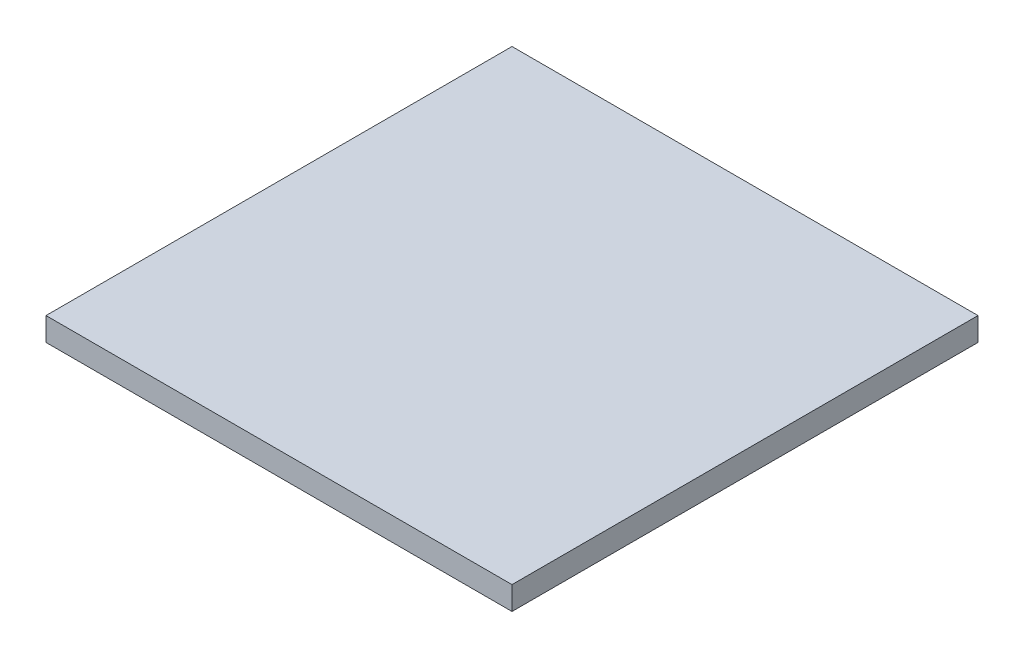
ISO-10303-21;
HEADER;
FILE_DESCRIPTION(('STEP AP214'),'2;1');
FILE_NAME('part.step','',(''),(''),'','','');
FILE_SCHEMA(('AUTOMOTIVE_DESIGN { 1 0 10303 214 1 1 1 1 }'));
ENDSEC;
DATA;
#1=APPLICATION_CONTEXT('core data for automotive mechanical design processes');
#2=APPLICATION_PROTOCOL_DEFINITION('international standard','automotive_design',2000,#1);
#3=PRODUCT_CONTEXT('',#1,'mechanical');
#4=PRODUCT('Part','Part','',(#3));
#5=PRODUCT_RELATED_PRODUCT_CATEGORY('part','',(#4));
#6=PRODUCT_DEFINITION_FORMATION('','',#4);
#7=PRODUCT_DEFINITION_CONTEXT('part definition',#1,'design');
#8=PRODUCT_DEFINITION('design','',#6,#7);
#9=PRODUCT_DEFINITION_SHAPE('','',#8);
#10=(LENGTH_UNIT() NAMED_UNIT(*) SI_UNIT(.MILLI.,.METRE.));
#11=(NAMED_UNIT(*) PLANE_ANGLE_UNIT() SI_UNIT($,.RADIAN.));
#12=(NAMED_UNIT(*) SI_UNIT($,.STERADIAN.) SOLID_ANGLE_UNIT());
#13=UNCERTAINTY_MEASURE_WITH_UNIT(LENGTH_MEASURE(1.E-05),#10,'distance_accuracy_value','');
#14=(GEOMETRIC_REPRESENTATION_CONTEXT(3) GLOBAL_UNCERTAINTY_ASSIGNED_CONTEXT((#13)) GLOBAL_UNIT_ASSIGNED_CONTEXT((#10,
#11,#12)) REPRESENTATION_CONTEXT('',''));
#15=CARTESIAN_POINT('',(0.,0.,0.));
#16=DIRECTION('',(0.,0.,1.));
#17=DIRECTION('',(1.,0.,0.));
#18=AXIS2_PLACEMENT_3D('',#15,#16,#17);
#19=CARTESIAN_POINT('',(0.,1.5,0.));
#20=DIRECTION('',(1.,0.,0.));
#21=DIRECTION('',(0.,0.,-1.));
#22=AXIS2_PLACEMENT_3D('',#19,#20,#21);
#23=PLANE('',#22);
#24=DIRECTION('',(0.,0.,1.));
#25=VECTOR('',#24,1.);
#26=CARTESIAN_POINT('',(0.,0.,0.));
#27=LINE('',#26,#25);
#28=CARTESIAN_POINT('',(0.,0.,-30.));
#29=VERTEX_POINT('',#28);
#30=CARTESIAN_POINT('',(0.,0.,0.));
#31=VERTEX_POINT('',#30);
#32=EDGE_CURVE('E96',#29,#31,#27,.T.);
#33=ORIENTED_EDGE('',*,*,#32,.T.);
#34=DIRECTION('',(0.,-1.,0.));
#35=VECTOR('',#34,1.);
#36=CARTESIAN_POINT('',(0.,1.5,0.));
#37=LINE('',#36,#35);
#38=CARTESIAN_POINT('',(0.,1.5,0.));
#39=VERTEX_POINT('',#38);
#40=EDGE_CURVE('E11',#39,#31,#37,.T.);
#41=ORIENTED_EDGE('',*,*,#40,.F.);
#42=DIRECTION('',(0.,0.,1.));
#43=VECTOR('',#42,1.);
#44=CARTESIAN_POINT('',(0.,1.5,0.));
#45=LINE('',#44,#43);
#46=CARTESIAN_POINT('',(0.,1.5,-30.));
#47=VERTEX_POINT('',#46);
#48=EDGE_CURVE('E84',#47,#39,#45,.T.);
#49=ORIENTED_EDGE('',*,*,#48,.F.);
#50=DIRECTION('',(0.,-1.,0.));
#51=VECTOR('',#50,1.);
#52=CARTESIAN_POINT('',(0.,1.5,-30.));
#53=LINE('',#52,#51);
#54=EDGE_CURVE('E92',#47,#29,#53,.T.);
#55=ORIENTED_EDGE('',*,*,#54,.T.);
#56=EDGE_LOOP('',(#33,#41,#49,#55));
#57=FACE_BOUND('',#56,.T.);
#58=ADVANCED_FACE('F33',(#57),#23,.F.);
#59=CARTESIAN_POINT('',(0.,1.5,0.));
#60=DIRECTION('',(0.,0.,-1.));
#61=DIRECTION('',(-1.,0.,0.));
#62=AXIS2_PLACEMENT_3D('',#59,#60,#61);
#63=PLANE('',#62);
#64=DIRECTION('',(1.,0.,0.));
#65=VECTOR('',#64,1.);
#66=CARTESIAN_POINT('',(0.,0.,0.));
#67=LINE('',#66,#65);
#68=CARTESIAN_POINT('',(30.,0.,0.));
#69=VERTEX_POINT('',#68);
#70=EDGE_CURVE('E88',#31,#69,#67,.T.);
#71=ORIENTED_EDGE('',*,*,#70,.T.);
#72=DIRECTION('',(0.,-1.,0.));
#73=VECTOR('',#72,1.);
#74=CARTESIAN_POINT('',(30.,1.5,0.));
#75=LINE('',#74,#73);
#76=CARTESIAN_POINT('',(30.,1.5,0.));
#77=VERTEX_POINT('',#76);
#78=EDGE_CURVE('E41',#77,#69,#75,.T.);
#79=ORIENTED_EDGE('',*,*,#78,.F.);
#80=DIRECTION('',(1.,0.,0.));
#81=VECTOR('',#80,1.);
#82=CARTESIAN_POINT('',(0.,1.5,0.));
#83=LINE('',#82,#81);
#84=EDGE_CURVE('E79',#39,#77,#83,.T.);
#85=ORIENTED_EDGE('',*,*,#84,.F.);
#86=ORIENTED_EDGE('',*,*,#40,.T.);
#87=EDGE_LOOP('',(#71,#79,#85,#86));
#88=FACE_BOUND('',#87,.T.);
#89=ADVANCED_FACE('F87',(#88),#63,.F.);
#90=CARTESIAN_POINT('',(30.,1.5,0.));
#91=DIRECTION('',(-1.,0.,0.));
#92=DIRECTION('',(0.,0.,1.));
#93=AXIS2_PLACEMENT_3D('',#90,#91,#92);
#94=PLANE('',#93);
#95=DIRECTION('',(0.,0.,-1.));
#96=VECTOR('',#95,1.);
#97=CARTESIAN_POINT('',(30.,0.,0.));
#98=LINE('',#97,#96);
#99=CARTESIAN_POINT('',(30.,0.,-30.));
#100=VERTEX_POINT('',#99);
#101=EDGE_CURVE('E66',#69,#100,#98,.T.);
#102=ORIENTED_EDGE('',*,*,#101,.T.);
#103=DIRECTION('',(0.,-1.,0.));
#104=VECTOR('',#103,1.);
#105=CARTESIAN_POINT('',(30.,1.5,-30.));
#106=LINE('',#105,#104);
#107=CARTESIAN_POINT('',(30.,1.5,-30.));
#108=VERTEX_POINT('',#107);
#109=EDGE_CURVE('E89',#108,#100,#106,.T.);
#110=ORIENTED_EDGE('',*,*,#109,.F.);
#111=DIRECTION('',(0.,0.,-1.));
#112=VECTOR('',#111,1.);
#113=CARTESIAN_POINT('',(30.,1.5,0.));
#114=LINE('',#113,#112);
#115=EDGE_CURVE('E82',#77,#108,#114,.T.);
#116=ORIENTED_EDGE('',*,*,#115,.F.);
#117=ORIENTED_EDGE('',*,*,#78,.T.);
#118=EDGE_LOOP('',(#102,#110,#116,#117));
#119=FACE_BOUND('',#118,.T.);
#120=ADVANCED_FACE('F90',(#119),#94,.F.);
#121=CARTESIAN_POINT('',(0.,1.5,-30.));
#122=DIRECTION('',(0.,0.,1.));
#123=DIRECTION('',(1.,0.,0.));
#124=AXIS2_PLACEMENT_3D('',#121,#122,#123);
#125=PLANE('',#124);
#126=DIRECTION('',(-1.,0.,0.));
#127=VECTOR('',#126,1.);
#128=CARTESIAN_POINT('',(0.,0.,-30.));
#129=LINE('',#128,#127);
#130=EDGE_CURVE('E72',#100,#29,#129,.T.);
#131=ORIENTED_EDGE('',*,*,#130,.T.);
#132=ORIENTED_EDGE('',*,*,#54,.F.);
#133=DIRECTION('',(-1.,0.,0.));
#134=VECTOR('',#133,1.);
#135=CARTESIAN_POINT('',(0.,1.5,-30.));
#136=LINE('',#135,#134);
#137=EDGE_CURVE('E49',#108,#47,#136,.T.);
#138=ORIENTED_EDGE('',*,*,#137,.F.);
#139=ORIENTED_EDGE('',*,*,#109,.T.);
#140=EDGE_LOOP('',(#131,#132,#138,#139));
#141=FACE_BOUND('',#140,.T.);
#142=ADVANCED_FACE('F103',(#141),#125,.F.);
#143=CARTESIAN_POINT('',(0.,1.5,-30.));
#144=DIRECTION('',(0.,-1.,0.));
#145=DIRECTION('',(0.,0.,-1.));
#146=AXIS2_PLACEMENT_3D('',#143,#144,#145);
#147=PLANE('',#146);
#148=ORIENTED_EDGE('',*,*,#48,.T.);
#149=ORIENTED_EDGE('',*,*,#84,.T.);
#150=ORIENTED_EDGE('',*,*,#115,.T.);
#151=ORIENTED_EDGE('',*,*,#137,.T.);
#152=EDGE_LOOP('',(#148,#149,#150,#151));
#153=FACE_BOUND('',#152,.T.);
#154=ADVANCED_FACE('F80',(#153),#147,.F.);
#155=CARTESIAN_POINT('',(0.,0.,-30.));
#156=DIRECTION('',(0.,-1.,0.));
#157=DIRECTION('',(0.,0.,-1.));
#158=AXIS2_PLACEMENT_3D('',#155,#156,#157);
#159=PLANE('',#158);
#160=ORIENTED_EDGE('',*,*,#32,.F.);
#161=ORIENTED_EDGE('',*,*,#130,.F.);
#162=ORIENTED_EDGE('',*,*,#101,.F.);
#163=ORIENTED_EDGE('',*,*,#70,.F.);
#164=EDGE_LOOP('',(#160,#161,#162,#163));
#165=FACE_BOUND('',#164,.T.);
#166=ADVANCED_FACE('F106',(#165),#159,.T.);
#167=CLOSED_SHELL('',(#58,#89,#120,#142,#154,#166));
#168=MANIFOLD_SOLID_BREP('B2',#167);
#169=ADVANCED_BREP_SHAPE_REPRESENTATION('',(#18,#168),#14);
#170=SHAPE_DEFINITION_REPRESENTATION(#9,#169);
ENDSEC;
END-ISO-10303-21;
